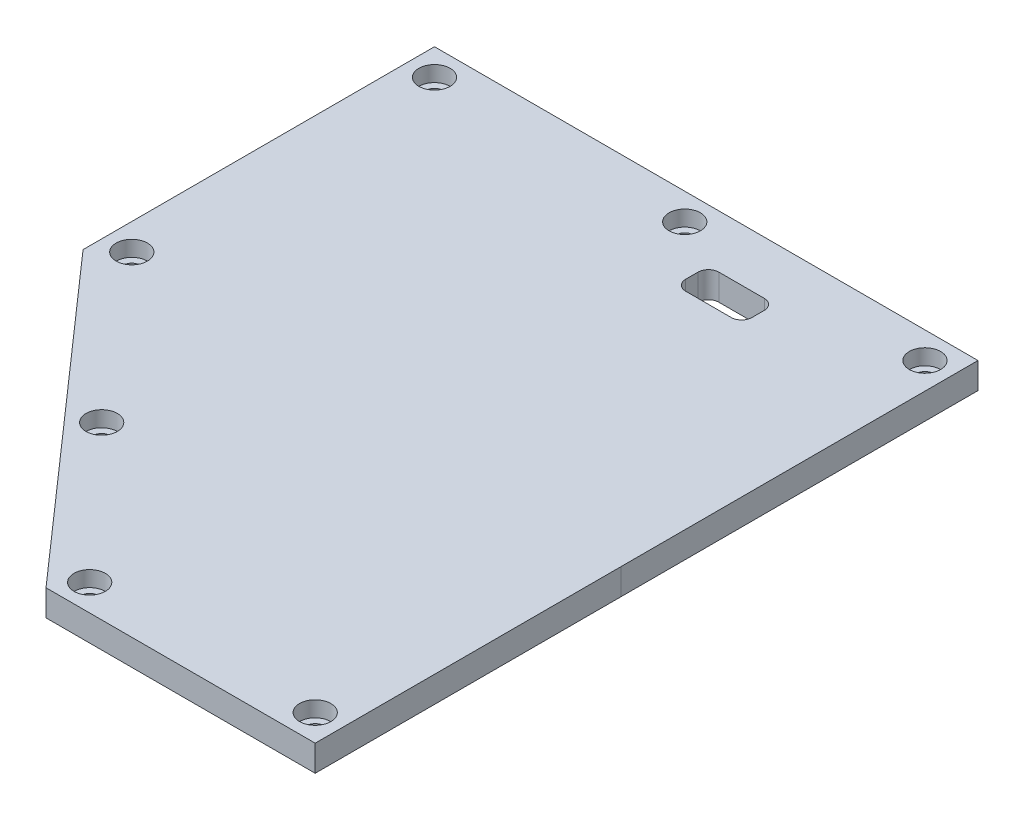
ISO-10303-21;
HEADER;
FILE_DESCRIPTION(('STEP AP214'),'2;1');
FILE_NAME('part.step','',(''),(''),'','','');
FILE_SCHEMA(('AUTOMOTIVE_DESIGN { 1 0 10303 214 1 1 1 1 }'));
ENDSEC;
DATA;
#1=APPLICATION_CONTEXT('core data for automotive mechanical design processes');
#2=APPLICATION_PROTOCOL_DEFINITION('international standard','automotive_design',2000,#1);
#3=PRODUCT_CONTEXT('',#1,'mechanical');
#4=PRODUCT('Part','Part','',(#3));
#5=PRODUCT_RELATED_PRODUCT_CATEGORY('part','',(#4));
#6=PRODUCT_DEFINITION_FORMATION('','',#4);
#7=PRODUCT_DEFINITION_CONTEXT('part definition',#1,'design');
#8=PRODUCT_DEFINITION('design','',#6,#7);
#9=PRODUCT_DEFINITION_SHAPE('','',#8);
#10=(LENGTH_UNIT() NAMED_UNIT(*) SI_UNIT(.MILLI.,.METRE.));
#11=(NAMED_UNIT(*) PLANE_ANGLE_UNIT() SI_UNIT($,.RADIAN.));
#12=(NAMED_UNIT(*) SI_UNIT($,.STERADIAN.) SOLID_ANGLE_UNIT());
#13=UNCERTAINTY_MEASURE_WITH_UNIT(LENGTH_MEASURE(1.E-05),#10,'distance_accuracy_value','');
#14=(GEOMETRIC_REPRESENTATION_CONTEXT(3) GLOBAL_UNCERTAINTY_ASSIGNED_CONTEXT((#13)) GLOBAL_UNIT_ASSIGNED_CONTEXT((#10,
#11,#12)) REPRESENTATION_CONTEXT('',''));
#15=CARTESIAN_POINT('',(0.,0.,0.));
#16=DIRECTION('',(0.,0.,1.));
#17=DIRECTION('',(1.,0.,0.));
#18=AXIS2_PLACEMENT_3D('',#15,#16,#17);
#19=CARTESIAN_POINT('',(5.08,5.,63.08));
#20=DIRECTION('',(0.,1.,0.));
#21=DIRECTION('',(0.,0.,1.));
#22=AXIS2_PLACEMENT_3D('',#19,#20,#21);
#23=CYLINDRICAL_SURFACE('',#22,1.64999999999999);
#24=CARTESIAN_POINT('',(5.08,0.,63.08));
#25=DIRECTION('',(0.,1.,0.));
#26=DIRECTION('',(0.,0.,1.));
#27=AXIS2_PLACEMENT_3D('',#24,#25,#26);
#28=CIRCLE('',#27,1.65);
#29=CARTESIAN_POINT('',(5.08,0.,64.73));
#30=VERTEX_POINT('',#29);
#31=EDGE_CURVE('E306',#30,#30,#28,.T.);
#32=ORIENTED_EDGE('',*,*,#31,.F.);
#33=EDGE_LOOP('',(#32));
#34=FACE_BOUND('',#33,.T.);
#35=CARTESIAN_POINT('',(5.08,2.,63.08));
#36=DIRECTION('',(0.,1.,0.));
#37=DIRECTION('',(0.,0.,1.));
#38=AXIS2_PLACEMENT_3D('',#35,#36,#37);
#39=CIRCLE('',#38,1.64999999999999);
#40=CARTESIAN_POINT('',(5.08,2.,64.73));
#41=VERTEX_POINT('',#40);
#42=EDGE_CURVE('E43',#41,#41,#39,.F.);
#43=ORIENTED_EDGE('',*,*,#42,.F.);
#44=EDGE_LOOP('',(#43));
#45=FACE_BOUND('',#44,.T.);
#46=ADVANCED_FACE('F39',(#34,#45),#23,.F.);
#47=CARTESIAN_POINT('',(30.4656304033941,5.,94.2360567244944));
#48=DIRECTION('',(0.,1.,0.));
#49=DIRECTION('',(0.,0.,1.));
#50=AXIS2_PLACEMENT_3D('',#47,#48,#49);
#51=CYLINDRICAL_SURFACE('',#50,1.65);
#52=CARTESIAN_POINT('',(30.4656304033941,0.,94.2360567244944));
#53=DIRECTION('',(0.,1.,0.));
#54=DIRECTION('',(0.,0.,1.));
#55=AXIS2_PLACEMENT_3D('',#52,#53,#54);
#56=CIRCLE('',#55,1.65);
#57=CARTESIAN_POINT('',(30.4656304033941,0.,95.8860567244944));
#58=VERTEX_POINT('',#57);
#59=EDGE_CURVE('E302',#58,#58,#56,.T.);
#60=ORIENTED_EDGE('',*,*,#59,.F.);
#61=EDGE_LOOP('',(#60));
#62=FACE_BOUND('',#61,.T.);
#63=CARTESIAN_POINT('',(30.4656304033941,2.,94.2360567244944));
#64=DIRECTION('',(0.,1.,0.));
#65=DIRECTION('',(0.,0.,1.));
#66=AXIS2_PLACEMENT_3D('',#63,#64,#65);
#67=CIRCLE('',#66,1.65);
#68=CARTESIAN_POINT('',(30.4656304033941,2.,95.8860567244944));
#69=VERTEX_POINT('',#68);
#70=EDGE_CURVE('E244',#69,#69,#67,.F.);
#71=ORIENTED_EDGE('',*,*,#70,.F.);
#72=EDGE_LOOP('',(#71));
#73=FACE_BOUND('',#72,.T.);
#74=ADVANCED_FACE('F376',(#62,#73),#51,.F.);
#75=CARTESIAN_POINT('',(55.850084456919,5.,121.919681711199));
#76=DIRECTION('',(0.,1.,0.));
#77=DIRECTION('',(0.,0.,1.));
#78=AXIS2_PLACEMENT_3D('',#75,#76,#77);
#79=CYLINDRICAL_SURFACE('',#78,1.65);
#80=CARTESIAN_POINT('',(55.850084456919,0.,121.919681711199));
#81=DIRECTION('',(0.,1.,0.));
#82=DIRECTION('',(0.,0.,1.));
#83=AXIS2_PLACEMENT_3D('',#80,#81,#82);
#84=CIRCLE('',#83,1.65);
#85=CARTESIAN_POINT('',(55.850084456919,0.,123.569681711199));
#86=VERTEX_POINT('',#85);
#87=EDGE_CURVE('E298',#86,#86,#84,.T.);
#88=ORIENTED_EDGE('',*,*,#87,.F.);
#89=EDGE_LOOP('',(#88));
#90=FACE_BOUND('',#89,.T.);
#91=CARTESIAN_POINT('',(55.850084456919,2.,121.919681711199));
#92=DIRECTION('',(0.,1.,0.));
#93=DIRECTION('',(0.,0.,1.));
#94=AXIS2_PLACEMENT_3D('',#91,#92,#93);
#95=CIRCLE('',#94,1.65);
#96=CARTESIAN_POINT('',(55.850084456919,2.,123.569681711199));
#97=VERTEX_POINT('',#96);
#98=EDGE_CURVE('E241',#97,#97,#95,.F.);
#99=ORIENTED_EDGE('',*,*,#98,.F.);
#100=EDGE_LOOP('',(#99));
#101=FACE_BOUND('',#100,.T.);
#102=ADVANCED_FACE('F382',(#90,#101),#79,.F.);
#103=CARTESIAN_POINT('',(99.060084456919,5.,121.919681711199));
#104=DIRECTION('',(0.,1.,0.));
#105=DIRECTION('',(0.,0.,1.));
#106=AXIS2_PLACEMENT_3D('',#103,#104,#105);
#107=CYLINDRICAL_SURFACE('',#106,1.64999999999999);
#108=CARTESIAN_POINT('',(99.060084456919,0.,121.919681711199));
#109=DIRECTION('',(0.,1.,0.));
#110=DIRECTION('',(0.,0.,1.));
#111=AXIS2_PLACEMENT_3D('',#108,#109,#110);
#112=CIRCLE('',#111,1.65);
#113=CARTESIAN_POINT('',(99.060084456919,0.,123.569681711199));
#114=VERTEX_POINT('',#113);
#115=EDGE_CURVE('E294',#114,#114,#112,.T.);
#116=ORIENTED_EDGE('',*,*,#115,.F.);
#117=EDGE_LOOP('',(#116));
#118=FACE_BOUND('',#117,.T.);
#119=CARTESIAN_POINT('',(99.060084456919,2.,121.919681711199));
#120=DIRECTION('',(0.,1.,0.));
#121=DIRECTION('',(0.,0.,1.));
#122=AXIS2_PLACEMENT_3D('',#119,#120,#121);
#123=CIRCLE('',#122,1.64999999999999);
#124=CARTESIAN_POINT('',(99.060084456919,2.,123.569681711199));
#125=VERTEX_POINT('',#124);
#126=EDGE_CURVE('E237',#125,#125,#123,.F.);
#127=ORIENTED_EDGE('',*,*,#126,.F.);
#128=EDGE_LOOP('',(#127));
#129=FACE_BOUND('',#128,.T.);
#130=ADVANCED_FACE('F630',(#118,#129),#107,.F.);
#131=CARTESIAN_POINT('',(99.0600062743914,5.,5.08));
#132=DIRECTION('',(0.,1.,0.));
#133=DIRECTION('',(0.,0.,1.));
#134=AXIS2_PLACEMENT_3D('',#131,#132,#133);
#135=CYLINDRICAL_SURFACE('',#134,1.64999999999999);
#136=CARTESIAN_POINT('',(99.0600062743914,0.,5.08));
#137=DIRECTION('',(0.,1.,0.));
#138=DIRECTION('',(0.,0.,1.));
#139=AXIS2_PLACEMENT_3D('',#136,#137,#138);
#140=CIRCLE('',#139,1.65);
#141=CARTESIAN_POINT('',(99.0600062743914,0.,6.73));
#142=VERTEX_POINT('',#141);
#143=EDGE_CURVE('E290',#142,#142,#140,.T.);
#144=ORIENTED_EDGE('',*,*,#143,.F.);
#145=EDGE_LOOP('',(#144));
#146=FACE_BOUND('',#145,.T.);
#147=CARTESIAN_POINT('',(99.0600062743914,2.,5.08));
#148=DIRECTION('',(0.,1.,0.));
#149=DIRECTION('',(0.,0.,1.));
#150=AXIS2_PLACEMENT_3D('',#147,#148,#149);
#151=CIRCLE('',#150,1.64999999999999);
#152=CARTESIAN_POINT('',(99.0600062743914,2.,6.72999999999999));
#153=VERTEX_POINT('',#152);
#154=EDGE_CURVE('E233',#153,#153,#151,.F.);
#155=ORIENTED_EDGE('',*,*,#154,.F.);
#156=EDGE_LOOP('',(#155));
#157=FACE_BOUND('',#156,.T.);
#158=ADVANCED_FACE('F638',(#146,#157),#135,.F.);
#159=CARTESIAN_POINT('',(53.03,5.,5.08));
#160=DIRECTION('',(0.,1.,0.));
#161=DIRECTION('',(0.,0.,1.));
#162=AXIS2_PLACEMENT_3D('',#159,#160,#161);
#163=CYLINDRICAL_SURFACE('',#162,1.65);
#164=CARTESIAN_POINT('',(53.03,0.,5.08));
#165=DIRECTION('',(0.,1.,0.));
#166=DIRECTION('',(0.,0.,1.));
#167=AXIS2_PLACEMENT_3D('',#164,#165,#166);
#168=CIRCLE('',#167,1.65);
#169=CARTESIAN_POINT('',(53.03,0.,6.73));
#170=VERTEX_POINT('',#169);
#171=EDGE_CURVE('E286',#170,#170,#168,.T.);
#172=ORIENTED_EDGE('',*,*,#171,.F.);
#173=EDGE_LOOP('',(#172));
#174=FACE_BOUND('',#173,.T.);
#175=CARTESIAN_POINT('',(53.03,2.,5.08));
#176=DIRECTION('',(0.,1.,0.));
#177=DIRECTION('',(0.,0.,1.));
#178=AXIS2_PLACEMENT_3D('',#175,#176,#177);
#179=CIRCLE('',#178,1.65);
#180=CARTESIAN_POINT('',(53.03,2.,6.73));
#181=VERTEX_POINT('',#180);
#182=EDGE_CURVE('E228',#181,#181,#179,.F.);
#183=ORIENTED_EDGE('',*,*,#182,.F.);
#184=EDGE_LOOP('',(#183));
#185=FACE_BOUND('',#184,.T.);
#186=ADVANCED_FACE('F647',(#174,#185),#163,.F.);
#187=CARTESIAN_POINT('',(5.08,5.,5.08));
#188=DIRECTION('',(0.,1.,0.));
#189=DIRECTION('',(0.,0.,1.));
#190=AXIS2_PLACEMENT_3D('',#187,#188,#189);
#191=CYLINDRICAL_SURFACE('',#190,1.64999999999999);
#192=CARTESIAN_POINT('',(5.08,0.,5.08));
#193=DIRECTION('',(0.,1.,0.));
#194=DIRECTION('',(0.,0.,1.));
#195=AXIS2_PLACEMENT_3D('',#192,#193,#194);
#196=CIRCLE('',#195,1.65);
#197=CARTESIAN_POINT('',(5.08,0.,6.73));
#198=VERTEX_POINT('',#197);
#199=EDGE_CURVE('E277',#198,#198,#196,.T.);
#200=ORIENTED_EDGE('',*,*,#199,.F.);
#201=EDGE_LOOP('',(#200));
#202=FACE_BOUND('',#201,.T.);
#203=CARTESIAN_POINT('',(5.08,2.,5.08));
#204=DIRECTION('',(0.,1.,0.));
#205=DIRECTION('',(0.,0.,1.));
#206=AXIS2_PLACEMENT_3D('',#203,#204,#205);
#207=CIRCLE('',#206,1.64999999999999);
#208=CARTESIAN_POINT('',(5.08,2.,6.73));
#209=VERTEX_POINT('',#208);
#210=EDGE_CURVE('E224',#209,#209,#207,.F.);
#211=ORIENTED_EDGE('',*,*,#210,.F.);
#212=EDGE_LOOP('',(#211));
#213=FACE_BOUND('',#212,.T.);
#214=ADVANCED_FACE('F656',(#202,#213),#191,.F.);
#215=CARTESIAN_POINT('',(0.,5.,0.));
#216=DIRECTION('',(1.,0.,0.));
#217=DIRECTION('',(0.,0.,-1.));
#218=AXIS2_PLACEMENT_3D('',#215,#216,#217);
#219=PLANE('',#218);
#220=DIRECTION('',(0.,0.,1.));
#221=VECTOR('',#220,1.);
#222=CARTESIAN_POINT('',(0.,0.,0.));
#223=LINE('',#222,#221);
#224=CARTESIAN_POINT('',(0.,0.,0.));
#225=VERTEX_POINT('',#224);
#226=CARTESIAN_POINT('',(0.,0.,67.34));
#227=VERTEX_POINT('',#226);
#228=EDGE_CURVE('E169',#225,#227,#223,.T.);
#229=ORIENTED_EDGE('',*,*,#228,.T.);
#230=DIRECTION('',(0.,-1.,0.));
#231=VECTOR('',#230,1.);
#232=CARTESIAN_POINT('',(0.,5.,67.34));
#233=LINE('',#232,#231);
#234=CARTESIAN_POINT('',(0.,5.,67.34));
#235=VERTEX_POINT('',#234);
#236=EDGE_CURVE('E147',#235,#227,#233,.T.);
#237=ORIENTED_EDGE('',*,*,#236,.F.);
#238=DIRECTION('',(0.,0.,1.));
#239=VECTOR('',#238,1.);
#240=CARTESIAN_POINT('',(0.,5.,0.));
#241=LINE('',#240,#239);
#242=CARTESIAN_POINT('',(0.,5.,0.));
#243=VERTEX_POINT('',#242);
#244=EDGE_CURVE('E155',#243,#235,#241,.T.);
#245=ORIENTED_EDGE('',*,*,#244,.F.);
#246=DIRECTION('',(0.,-1.,0.));
#247=VECTOR('',#246,1.);
#248=CARTESIAN_POINT('',(0.,5.,0.));
#249=LINE('',#248,#247);
#250=EDGE_CURVE('E320',#243,#225,#249,.T.);
#251=ORIENTED_EDGE('',*,*,#250,.T.);
#252=EDGE_LOOP('',(#229,#237,#245,#251));
#253=FACE_BOUND('',#252,.T.);
#254=ADVANCED_FACE('F167',(#253),#219,.F.);
#255=CARTESIAN_POINT('',(0.,5.,67.34));
#256=DIRECTION('',(0.75034186531504,0.,-0.661049986881134));
#257=DIRECTION('',(-0.661049986881134,0.,-0.75034186531504));
#258=AXIS2_PLACEMENT_3D('',#255,#256,#257);
#259=PLANE('',#258);
#260=DIRECTION('',(0.661049986881134,0.,0.75034186531504));
#261=VECTOR('',#260,1.);
#262=CARTESIAN_POINT('',(0.,0.,67.34));
#263=LINE('',#262,#261);
#264=CARTESIAN_POINT('',(52.560084456919,0.,126.999681711199));
#265=VERTEX_POINT('',#264);
#266=EDGE_CURVE('E323',#227,#265,#263,.T.);
#267=ORIENTED_EDGE('',*,*,#266,.T.);
#268=DIRECTION('',(0.,-1.,0.));
#269=VECTOR('',#268,1.);
#270=CARTESIAN_POINT('',(52.560084456919,5.,126.999681711199));
#271=LINE('',#270,#269);
#272=CARTESIAN_POINT('',(52.560084456919,5.,126.999681711199));
#273=VERTEX_POINT('',#272);
#274=EDGE_CURVE('E150',#273,#265,#271,.T.);
#275=ORIENTED_EDGE('',*,*,#274,.F.);
#276=DIRECTION('',(0.661049986881134,0.,0.75034186531504));
#277=VECTOR('',#276,1.);
#278=CARTESIAN_POINT('',(0.,5.,67.34));
#279=LINE('',#278,#277);
#280=EDGE_CURVE('E143',#235,#273,#279,.T.);
#281=ORIENTED_EDGE('',*,*,#280,.F.);
#282=ORIENTED_EDGE('',*,*,#236,.T.);
#283=EDGE_LOOP('',(#267,#275,#281,#282));
#284=FACE_BOUND('',#283,.T.);
#285=ADVANCED_FACE('F145',(#284),#259,.F.);
#286=CARTESIAN_POINT('',(104.140084456919,5.,126.999681711199));
#287=DIRECTION('',(0.,0.,-1.));
#288=DIRECTION('',(-1.,0.,0.));
#289=AXIS2_PLACEMENT_3D('',#286,#287,#288);
#290=PLANE('',#289);
#291=DIRECTION('',(1.,0.,0.));
#292=VECTOR('',#291,1.);
#293=CARTESIAN_POINT('',(104.140084456919,0.,126.999681711199));
#294=LINE('',#293,#292);
#295=CARTESIAN_POINT('',(104.140084456919,0.,126.999681711199));
#296=VERTEX_POINT('',#295);
#297=EDGE_CURVE('E326',#265,#296,#294,.T.);
#298=ORIENTED_EDGE('',*,*,#297,.T.);
#299=DIRECTION('',(0.,-1.,0.));
#300=VECTOR('',#299,1.);
#301=CARTESIAN_POINT('',(104.140084456919,5.,126.999681711199));
#302=LINE('',#301,#300);
#303=CARTESIAN_POINT('',(104.140084456919,5.,126.999681711199));
#304=VERTEX_POINT('',#303);
#305=EDGE_CURVE('E177',#304,#296,#302,.T.);
#306=ORIENTED_EDGE('',*,*,#305,.F.);
#307=DIRECTION('',(1.,0.,0.));
#308=VECTOR('',#307,1.);
#309=CARTESIAN_POINT('',(104.140084456919,5.,126.999681711199));
#310=LINE('',#309,#308);
#311=EDGE_CURVE('E154',#273,#304,#310,.T.);
#312=ORIENTED_EDGE('',*,*,#311,.F.);
#313=ORIENTED_EDGE('',*,*,#274,.T.);
#314=EDGE_LOOP('',(#298,#306,#312,#313));
#315=FACE_BOUND('',#314,.T.);
#316=ADVANCED_FACE('F366',(#315),#290,.F.);
#317=CARTESIAN_POINT('',(104.140084456919,5.,68.3796817111988));
#318=DIRECTION('',(-1.,0.,0.));
#319=DIRECTION('',(0.,0.,1.));
#320=AXIS2_PLACEMENT_3D('',#317,#318,#319);
#321=PLANE('',#320);
#322=DIRECTION('',(0.,0.,-1.));
#323=VECTOR('',#322,1.);
#324=CARTESIAN_POINT('',(104.140084456919,0.,68.3796817111988));
#325=LINE('',#324,#323);
#326=CARTESIAN_POINT('',(104.140084456919,0.,68.3796817111988));
#327=VERTEX_POINT('',#326);
#328=EDGE_CURVE('E329',#296,#327,#325,.T.);
#329=ORIENTED_EDGE('',*,*,#328,.T.);
#330=DIRECTION('',(0.,-1.,0.));
#331=VECTOR('',#330,1.);
#332=CARTESIAN_POINT('',(104.140084456919,5.,68.3796817111988));
#333=LINE('',#332,#331);
#334=CARTESIAN_POINT('',(104.140084456919,5.,68.3796817111988));
#335=VERTEX_POINT('',#334);
#336=EDGE_CURVE('E343',#335,#327,#333,.T.);
#337=ORIENTED_EDGE('',*,*,#336,.F.);
#338=DIRECTION('',(0.,0.,-1.));
#339=VECTOR('',#338,1.);
#340=CARTESIAN_POINT('',(104.140084456919,5.,68.3796817111988));
#341=LINE('',#340,#339);
#342=EDGE_CURVE('E312',#304,#335,#341,.T.);
#343=ORIENTED_EDGE('',*,*,#342,.F.);
#344=ORIENTED_EDGE('',*,*,#305,.T.);
#345=EDGE_LOOP('',(#329,#337,#343,#344));
#346=FACE_BOUND('',#345,.T.);
#347=ADVANCED_FACE('F352',(#346),#321,.F.);
#348=CARTESIAN_POINT('',(104.14,5.,0.));
#349=DIRECTION('',(-0.999999999999237,0.,1.2351171705755E-06));
#350=DIRECTION('',(1.2351171705755E-06,0.,0.999999999999237));
#351=AXIS2_PLACEMENT_3D('',#348,#349,#350);
#352=PLANE('',#351);
#353=DIRECTION('',(-1.2351171705755E-06,0.,-0.999999999999237));
#354=VECTOR('',#353,1.);
#355=CARTESIAN_POINT('',(104.14,0.,0.));
#356=LINE('',#355,#354);
#357=CARTESIAN_POINT('',(104.14,0.,0.));
#358=VERTEX_POINT('',#357);
#359=EDGE_CURVE('E332',#327,#358,#356,.T.);
#360=ORIENTED_EDGE('',*,*,#359,.T.);
#361=DIRECTION('',(0.,-1.,0.));
#362=VECTOR('',#361,1.);
#363=CARTESIAN_POINT('',(104.14,5.,0.));
#364=LINE('',#363,#362);
#365=CARTESIAN_POINT('',(104.14,5.,0.));
#366=VERTEX_POINT('',#365);
#367=EDGE_CURVE('E339',#366,#358,#364,.T.);
#368=ORIENTED_EDGE('',*,*,#367,.F.);
#369=DIRECTION('',(-1.2351171705755E-06,0.,-0.999999999999237));
#370=VECTOR('',#369,1.);
#371=CARTESIAN_POINT('',(104.14,5.,0.));
#372=LINE('',#371,#370);
#373=EDGE_CURVE('E315',#335,#366,#372,.T.);
#374=ORIENTED_EDGE('',*,*,#373,.F.);
#375=ORIENTED_EDGE('',*,*,#336,.T.);
#376=EDGE_LOOP('',(#360,#368,#374,#375));
#377=FACE_BOUND('',#376,.T.);
#378=ADVANCED_FACE('F362',(#377),#352,.F.);
#379=CARTESIAN_POINT('',(0.,5.,0.));
#380=DIRECTION('',(0.,0.,1.));
#381=DIRECTION('',(1.,0.,0.));
#382=AXIS2_PLACEMENT_3D('',#379,#380,#381);
#383=PLANE('',#382);
#384=DIRECTION('',(-1.,0.,0.));
#385=VECTOR('',#384,1.);
#386=CARTESIAN_POINT('',(0.,0.,0.));
#387=LINE('',#386,#385);
#388=EDGE_CURVE('E165',#358,#225,#387,.T.);
#389=ORIENTED_EDGE('',*,*,#388,.T.);
#390=ORIENTED_EDGE('',*,*,#250,.F.);
#391=DIRECTION('',(-1.,0.,0.));
#392=VECTOR('',#391,1.);
#393=CARTESIAN_POINT('',(0.,5.,0.));
#394=LINE('',#393,#392);
#395=EDGE_CURVE('E160',#366,#243,#394,.T.);
#396=ORIENTED_EDGE('',*,*,#395,.F.);
#397=ORIENTED_EDGE('',*,*,#367,.T.);
#398=EDGE_LOOP('',(#389,#390,#396,#397));
#399=FACE_BOUND('',#398,.T.);
#400=ADVANCED_FACE('F365',(#399),#383,.F.);
#401=CARTESIAN_POINT('',(0.,5.,0.));
#402=DIRECTION('',(0.,-1.,0.));
#403=DIRECTION('',(0.,0.,-1.));
#404=AXIS2_PLACEMENT_3D('',#401,#402,#403);
#405=PLANE('',#404);
#406=CARTESIAN_POINT('',(99.060084456919,5.,121.919681711199));
#407=DIRECTION('',(0.,1.,0.));
#408=DIRECTION('',(0.,0.,1.));
#409=AXIS2_PLACEMENT_3D('',#406,#407,#408);
#410=CIRCLE('',#409,3.00000000000001);
#411=CARTESIAN_POINT('',(99.060084456919,5.,124.919681711199));
#412=VERTEX_POINT('',#411);
#413=EDGE_CURVE('E802',#412,#412,#410,.T.);
#414=ORIENTED_EDGE('',*,*,#413,.F.);
#415=EDGE_LOOP('',(#414));
#416=FACE_BOUND('',#415,.T.);
#417=CARTESIAN_POINT('',(30.4656304033941,5.,94.2360567244944));
#418=DIRECTION('',(0.,1.,0.));
#419=DIRECTION('',(0.,0.,1.));
#420=AXIS2_PLACEMENT_3D('',#417,#418,#419);
#421=CIRCLE('',#420,3.);
#422=CARTESIAN_POINT('',(30.4656304033941,5.,97.2360567244944));
#423=VERTEX_POINT('',#422);
#424=EDGE_CURVE('E760',#423,#423,#421,.T.);
#425=ORIENTED_EDGE('',*,*,#424,.F.);
#426=EDGE_LOOP('',(#425));
#427=FACE_BOUND('',#426,.T.);
#428=CARTESIAN_POINT('',(5.08,5.,63.08));
#429=DIRECTION('',(0.,1.,0.));
#430=DIRECTION('',(0.,0.,1.));
#431=AXIS2_PLACEMENT_3D('',#428,#429,#430);
#432=CIRCLE('',#431,3.);
#433=CARTESIAN_POINT('',(5.08,5.,66.08));
#434=VERTEX_POINT('',#433);
#435=EDGE_CURVE('E753',#434,#434,#432,.T.);
#436=ORIENTED_EDGE('',*,*,#435,.F.);
#437=EDGE_LOOP('',(#436));
#438=FACE_BOUND('',#437,.T.);
#439=CARTESIAN_POINT('',(5.08,5.,5.08));
#440=DIRECTION('',(0.,1.,0.));
#441=DIRECTION('',(0.,0.,1.));
#442=AXIS2_PLACEMENT_3D('',#439,#440,#441);
#443=CIRCLE('',#442,3.);
#444=CARTESIAN_POINT('',(5.08,5.,8.08));
#445=VERTEX_POINT('',#444);
#446=EDGE_CURVE('E763',#445,#445,#443,.T.);
#447=ORIENTED_EDGE('',*,*,#446,.F.);
#448=EDGE_LOOP('',(#447));
#449=FACE_BOUND('',#448,.T.);
#450=CARTESIAN_POINT('',(53.03,5.,5.08));
#451=DIRECTION('',(0.,1.,0.));
#452=DIRECTION('',(0.,0.,1.));
#453=AXIS2_PLACEMENT_3D('',#450,#451,#452);
#454=CIRCLE('',#453,3.);
#455=CARTESIAN_POINT('',(53.03,5.,8.08));
#456=VERTEX_POINT('',#455);
#457=EDGE_CURVE('E826',#456,#456,#454,.T.);
#458=ORIENTED_EDGE('',*,*,#457,.F.);
#459=EDGE_LOOP('',(#458));
#460=FACE_BOUND('',#459,.T.);
#461=CARTESIAN_POINT('',(99.0600062743914,5.,5.08));
#462=DIRECTION('',(0.,1.,0.));
#463=DIRECTION('',(0.,0.,1.));
#464=AXIS2_PLACEMENT_3D('',#461,#462,#463);
#465=CIRCLE('',#464,2.99999999999999);
#466=CARTESIAN_POINT('',(99.0600062743914,5.,8.08));
#467=VERTEX_POINT('',#466);
#468=EDGE_CURVE('E810',#467,#467,#465,.T.);
#469=ORIENTED_EDGE('',*,*,#468,.F.);
#470=EDGE_LOOP('',(#469));
#471=FACE_BOUND('',#470,.T.);
#472=CARTESIAN_POINT('',(55.850084456919,5.,121.919681711199));
#473=DIRECTION('',(0.,1.,0.));
#474=DIRECTION('',(0.,0.,1.));
#475=AXIS2_PLACEMENT_3D('',#472,#473,#474);
#476=CIRCLE('',#475,3.);
#477=CARTESIAN_POINT('',(55.850084456919,5.,124.919681711199));
#478=VERTEX_POINT('',#477);
#479=EDGE_CURVE('E774',#478,#478,#476,.T.);
#480=ORIENTED_EDGE('',*,*,#479,.F.);
#481=EDGE_LOOP('',(#480));
#482=FACE_BOUND('',#481,.T.);
#483=DIRECTION('',(0.,0.,1.));
#484=VECTOR('',#483,1.);
#485=CARTESIAN_POINT('',(62.65,5.,10.16));
#486=LINE('',#485,#484);
#487=CARTESIAN_POINT('',(62.65,5.,12.16));
#488=VERTEX_POINT('',#487);
#489=CARTESIAN_POINT('',(62.65,5.,14.51));
#490=VERTEX_POINT('',#489);
#491=EDGE_CURVE('E263',#488,#490,#486,.T.);
#492=ORIENTED_EDGE('',*,*,#491,.F.);
#493=CARTESIAN_POINT('',(64.65,5.,12.16));
#494=DIRECTION('',(0.,-1.,0.));
#495=DIRECTION('',(0.,0.,-1.));
#496=AXIS2_PLACEMENT_3D('',#493,#494,#495);
#497=CIRCLE('',#496,2.);
#498=CARTESIAN_POINT('',(64.65,5.,10.16));
#499=VERTEX_POINT('',#498);
#500=EDGE_CURVE('E204',#488,#499,#497,.T.);
#501=ORIENTED_EDGE('',*,*,#500,.T.);
#502=DIRECTION('',(-1.,0.,0.));
#503=VECTOR('',#502,1.);
#504=CARTESIAN_POINT('',(62.65,5.,10.16));
#505=LINE('',#504,#503);
#506=CARTESIAN_POINT('',(73.35,5.,10.16));
#507=VERTEX_POINT('',#506);
#508=EDGE_CURVE('E256',#507,#499,#505,.T.);
#509=ORIENTED_EDGE('',*,*,#508,.F.);
#510=CARTESIAN_POINT('',(73.35,5.,12.16));
#511=DIRECTION('',(0.,-1.,0.));
#512=DIRECTION('',(0.,0.,-1.));
#513=AXIS2_PLACEMENT_3D('',#510,#511,#512);
#514=CIRCLE('',#513,2.);
#515=CARTESIAN_POINT('',(75.35,5.,12.16));
#516=VERTEX_POINT('',#515);
#517=EDGE_CURVE('E210',#507,#516,#514,.T.);
#518=ORIENTED_EDGE('',*,*,#517,.T.);
#519=DIRECTION('',(0.,0.,-1.));
#520=VECTOR('',#519,1.);
#521=CARTESIAN_POINT('',(75.35,5.,10.16));
#522=LINE('',#521,#520);
#523=CARTESIAN_POINT('',(75.35,5.,14.51));
#524=VERTEX_POINT('',#523);
#525=EDGE_CURVE('E251',#524,#516,#522,.T.);
#526=ORIENTED_EDGE('',*,*,#525,.F.);
#527=CARTESIAN_POINT('',(73.35,5.,14.51));
#528=DIRECTION('',(0.,-1.,0.));
#529=DIRECTION('',(0.,0.,-1.));
#530=AXIS2_PLACEMENT_3D('',#527,#528,#529);
#531=CIRCLE('',#530,2.);
#532=CARTESIAN_POINT('',(73.35,5.,16.51));
#533=VERTEX_POINT('',#532);
#534=EDGE_CURVE('E216',#524,#533,#531,.T.);
#535=ORIENTED_EDGE('',*,*,#534,.T.);
#536=DIRECTION('',(1.,0.,0.));
#537=VECTOR('',#536,1.);
#538=CARTESIAN_POINT('',(62.65,5.,16.51));
#539=LINE('',#538,#537);
#540=CARTESIAN_POINT('',(64.65,5.,16.51));
#541=VERTEX_POINT('',#540);
#542=EDGE_CURVE('E272',#541,#533,#539,.T.);
#543=ORIENTED_EDGE('',*,*,#542,.F.);
#544=CARTESIAN_POINT('',(64.65,5.,14.51));
#545=DIRECTION('',(0.,-1.,0.));
#546=DIRECTION('',(0.,0.,-1.));
#547=AXIS2_PLACEMENT_3D('',#544,#545,#546);
#548=CIRCLE('',#547,2.);
#549=EDGE_CURVE('E49',#541,#490,#548,.T.);
#550=ORIENTED_EDGE('',*,*,#549,.T.);
#551=EDGE_LOOP('',(#492,#501,#509,#518,#526,#535,#543,#550));
#552=FACE_BOUND('',#551,.T.);
#553=ORIENTED_EDGE('',*,*,#244,.T.);
#554=ORIENTED_EDGE('',*,*,#280,.T.);
#555=ORIENTED_EDGE('',*,*,#311,.T.);
#556=ORIENTED_EDGE('',*,*,#342,.T.);
#557=ORIENTED_EDGE('',*,*,#373,.T.);
#558=ORIENTED_EDGE('',*,*,#395,.T.);
#559=EDGE_LOOP('',(#553,#554,#555,#556,#557,#558));
#560=FACE_BOUND('',#559,.T.);
#561=ADVANCED_FACE('F158',(#416,#427,#438,#449,#460,#471,#482,#552,#560),#405,.F.);
#562=CARTESIAN_POINT('',(0.,0.,0.));
#563=DIRECTION('',(0.,-1.,0.));
#564=DIRECTION('',(0.,0.,-1.));
#565=AXIS2_PLACEMENT_3D('',#562,#563,#564);
#566=PLANE('',#565);
#567=DIRECTION('',(0.,0.,-1.));
#568=VECTOR('',#567,1.);
#569=CARTESIAN_POINT('',(75.35,0.,10.16));
#570=LINE('',#569,#568);
#571=CARTESIAN_POINT('',(75.35,0.,14.51));
#572=VERTEX_POINT('',#571);
#573=CARTESIAN_POINT('',(75.35,0.,12.16));
#574=VERTEX_POINT('',#573);
#575=EDGE_CURVE('E273',#572,#574,#570,.T.);
#576=ORIENTED_EDGE('',*,*,#575,.T.);
#577=CARTESIAN_POINT('',(73.35,0.,12.16));
#578=DIRECTION('',(0.,-1.,0.));
#579=DIRECTION('',(0.,0.,-1.));
#580=AXIS2_PLACEMENT_3D('',#577,#578,#579);
#581=CIRCLE('',#580,2.);
#582=CARTESIAN_POINT('',(73.35,0.,10.16));
#583=VERTEX_POINT('',#582);
#584=EDGE_CURVE('E213',#574,#583,#581,.F.);
#585=ORIENTED_EDGE('',*,*,#584,.T.);
#586=DIRECTION('',(-1.,0.,0.));
#587=VECTOR('',#586,1.);
#588=CARTESIAN_POINT('',(62.65,0.,10.16));
#589=LINE('',#588,#587);
#590=CARTESIAN_POINT('',(64.65,0.,10.16));
#591=VERTEX_POINT('',#590);
#592=EDGE_CURVE('E267',#583,#591,#589,.T.);
#593=ORIENTED_EDGE('',*,*,#592,.T.);
#594=CARTESIAN_POINT('',(64.65,0.,12.16));
#595=DIRECTION('',(0.,-1.,0.));
#596=DIRECTION('',(0.,0.,-1.));
#597=AXIS2_PLACEMENT_3D('',#594,#595,#596);
#598=CIRCLE('',#597,2.);
#599=CARTESIAN_POINT('',(62.65,0.,12.16));
#600=VERTEX_POINT('',#599);
#601=EDGE_CURVE('E207',#591,#600,#598,.F.);
#602=ORIENTED_EDGE('',*,*,#601,.T.);
#603=DIRECTION('',(0.,0.,1.));
#604=VECTOR('',#603,1.);
#605=CARTESIAN_POINT('',(62.65,0.,10.16));
#606=LINE('',#605,#604);
#607=CARTESIAN_POINT('',(62.65,0.,14.51));
#608=VERTEX_POINT('',#607);
#609=EDGE_CURVE('E271',#600,#608,#606,.T.);
#610=ORIENTED_EDGE('',*,*,#609,.T.);
#611=CARTESIAN_POINT('',(64.65,0.,14.51));
#612=DIRECTION('',(0.,-1.,0.));
#613=DIRECTION('',(0.,0.,-1.));
#614=AXIS2_PLACEMENT_3D('',#611,#612,#613);
#615=CIRCLE('',#614,2.);
#616=CARTESIAN_POINT('',(64.65,0.,16.51));
#617=VERTEX_POINT('',#616);
#618=EDGE_CURVE('E11',#608,#617,#615,.F.);
#619=ORIENTED_EDGE('',*,*,#618,.T.);
#620=DIRECTION('',(1.,0.,0.));
#621=VECTOR('',#620,1.);
#622=CARTESIAN_POINT('',(62.65,0.,16.51));
#623=LINE('',#622,#621);
#624=CARTESIAN_POINT('',(73.35,0.,16.51));
#625=VERTEX_POINT('',#624);
#626=EDGE_CURVE('E278',#617,#625,#623,.T.);
#627=ORIENTED_EDGE('',*,*,#626,.T.);
#628=CARTESIAN_POINT('',(73.35,0.,14.51));
#629=DIRECTION('',(0.,-1.,0.));
#630=DIRECTION('',(0.,0.,-1.));
#631=AXIS2_PLACEMENT_3D('',#628,#629,#630);
#632=CIRCLE('',#631,2.);
#633=EDGE_CURVE('E219',#625,#572,#632,.F.);
#634=ORIENTED_EDGE('',*,*,#633,.T.);
#635=EDGE_LOOP('',(#576,#585,#593,#602,#610,#619,#627,#634));
#636=FACE_BOUND('',#635,.T.);
#637=ORIENTED_EDGE('',*,*,#199,.T.);
#638=EDGE_LOOP('',(#637));
#639=FACE_BOUND('',#638,.T.);
#640=ORIENTED_EDGE('',*,*,#171,.T.);
#641=EDGE_LOOP('',(#640));
#642=FACE_BOUND('',#641,.T.);
#643=ORIENTED_EDGE('',*,*,#143,.T.);
#644=EDGE_LOOP('',(#643));
#645=FACE_BOUND('',#644,.T.);
#646=ORIENTED_EDGE('',*,*,#115,.T.);
#647=EDGE_LOOP('',(#646));
#648=FACE_BOUND('',#647,.T.);
#649=ORIENTED_EDGE('',*,*,#87,.T.);
#650=EDGE_LOOP('',(#649));
#651=FACE_BOUND('',#650,.T.);
#652=ORIENTED_EDGE('',*,*,#59,.T.);
#653=EDGE_LOOP('',(#652));
#654=FACE_BOUND('',#653,.T.);
#655=ORIENTED_EDGE('',*,*,#31,.T.);
#656=EDGE_LOOP('',(#655));
#657=FACE_BOUND('',#656,.T.);
#658=ORIENTED_EDGE('',*,*,#228,.F.);
#659=ORIENTED_EDGE('',*,*,#388,.F.);
#660=ORIENTED_EDGE('',*,*,#359,.F.);
#661=ORIENTED_EDGE('',*,*,#328,.F.);
#662=ORIENTED_EDGE('',*,*,#297,.F.);
#663=ORIENTED_EDGE('',*,*,#266,.F.);
#664=EDGE_LOOP('',(#658,#659,#660,#661,#662,#663));
#665=FACE_BOUND('',#664,.T.);
#666=ADVANCED_FACE('F358',(#636,#639,#642,#645,#648,#651,#654,#657,#665),#566,.T.);
#667=CARTESIAN_POINT('',(62.65,-14.1990316571237,10.16));
#668=DIRECTION('',(0.,0.,-1.));
#669=DIRECTION('',(-1.,0.,0.));
#670=AXIS2_PLACEMENT_3D('',#667,#668,#669);
#671=PLANE('',#670);
#672=ORIENTED_EDGE('',*,*,#508,.T.);
#673=DIRECTION('',(0.,1.,0.));
#674=VECTOR('',#673,1.);
#675=CARTESIAN_POINT('',(64.65,0.,10.16));
#676=LINE('',#675,#674);
#677=EDGE_CURVE('E188',#499,#591,#676,.F.);
#678=ORIENTED_EDGE('',*,*,#677,.T.);
#679=ORIENTED_EDGE('',*,*,#592,.F.);
#680=DIRECTION('',(0.,1.,0.));
#681=VECTOR('',#680,1.);
#682=CARTESIAN_POINT('',(73.35,5.,10.16));
#683=LINE('',#682,#681);
#684=EDGE_CURVE('E184',#583,#507,#683,.T.);
#685=ORIENTED_EDGE('',*,*,#684,.T.);
#686=EDGE_LOOP('',(#672,#678,#679,#685));
#687=FACE_BOUND('',#686,.T.);
#688=ADVANCED_FACE('F394',(#687),#671,.F.);
#689=CARTESIAN_POINT('',(62.65,-14.1990316571237,10.16));
#690=DIRECTION('',(-1.,0.,0.));
#691=DIRECTION('',(0.,0.,1.));
#692=AXIS2_PLACEMENT_3D('',#689,#690,#691);
#693=PLANE('',#692);
#694=ORIENTED_EDGE('',*,*,#609,.F.);
#695=DIRECTION('',(0.,1.,0.));
#696=VECTOR('',#695,1.);
#697=CARTESIAN_POINT('',(62.65,5.,12.16));
#698=LINE('',#697,#696);
#699=EDGE_CURVE('E175',#600,#488,#698,.T.);
#700=ORIENTED_EDGE('',*,*,#699,.T.);
#701=ORIENTED_EDGE('',*,*,#491,.T.);
#702=DIRECTION('',(0.,1.,0.));
#703=VECTOR('',#702,1.);
#704=CARTESIAN_POINT('',(62.65,0.,14.51));
#705=LINE('',#704,#703);
#706=EDGE_CURVE('E171',#490,#608,#705,.F.);
#707=ORIENTED_EDGE('',*,*,#706,.T.);
#708=EDGE_LOOP('',(#694,#700,#701,#707));
#709=FACE_BOUND('',#708,.T.);
#710=ADVANCED_FACE('F422',(#709),#693,.F.);
#711=CARTESIAN_POINT('',(62.65,-14.1990316571237,16.51));
#712=DIRECTION('',(0.,0.,1.));
#713=DIRECTION('',(1.,0.,0.));
#714=AXIS2_PLACEMENT_3D('',#711,#712,#713);
#715=PLANE('',#714);
#716=ORIENTED_EDGE('',*,*,#542,.T.);
#717=DIRECTION('',(0.,1.,0.));
#718=VECTOR('',#717,1.);
#719=CARTESIAN_POINT('',(73.35,0.,16.51));
#720=LINE('',#719,#718);
#721=EDGE_CURVE('E57',#533,#625,#720,.F.);
#722=ORIENTED_EDGE('',*,*,#721,.T.);
#723=ORIENTED_EDGE('',*,*,#626,.F.);
#724=DIRECTION('',(0.,1.,0.));
#725=VECTOR('',#724,1.);
#726=CARTESIAN_POINT('',(64.65,5.,16.51));
#727=LINE('',#726,#725);
#728=EDGE_CURVE('E198',#617,#541,#727,.T.);
#729=ORIENTED_EDGE('',*,*,#728,.T.);
#730=EDGE_LOOP('',(#716,#722,#723,#729));
#731=FACE_BOUND('',#730,.T.);
#732=ADVANCED_FACE('F430',(#731),#715,.F.);
#733=CARTESIAN_POINT('',(75.35,-14.1990316571237,10.16));
#734=DIRECTION('',(1.,0.,0.));
#735=DIRECTION('',(0.,0.,-1.));
#736=AXIS2_PLACEMENT_3D('',#733,#734,#735);
#737=PLANE('',#736);
#738=ORIENTED_EDGE('',*,*,#525,.T.);
#739=DIRECTION('',(0.,1.,0.));
#740=VECTOR('',#739,1.);
#741=CARTESIAN_POINT('',(75.35,0.,12.16));
#742=LINE('',#741,#740);
#743=EDGE_CURVE('E195',#516,#574,#742,.F.);
#744=ORIENTED_EDGE('',*,*,#743,.T.);
#745=ORIENTED_EDGE('',*,*,#575,.F.);
#746=DIRECTION('',(0.,1.,0.));
#747=VECTOR('',#746,1.);
#748=CARTESIAN_POINT('',(75.35,5.,14.51));
#749=LINE('',#748,#747);
#750=EDGE_CURVE('E191',#572,#524,#749,.T.);
#751=ORIENTED_EDGE('',*,*,#750,.T.);
#752=EDGE_LOOP('',(#738,#744,#745,#751));
#753=FACE_BOUND('',#752,.T.);
#754=ADVANCED_FACE('F438',(#753),#737,.F.);
#755=CARTESIAN_POINT('',(64.65,-14.1990316571237,12.16));
#756=DIRECTION('',(0.,-1.,0.));
#757=DIRECTION('',(0.,0.,-1.));
#758=AXIS2_PLACEMENT_3D('',#755,#756,#757);
#759=CYLINDRICAL_SURFACE('',#758,2.);
#760=ORIENTED_EDGE('',*,*,#601,.F.);
#761=ORIENTED_EDGE('',*,*,#677,.F.);
#762=ORIENTED_EDGE('',*,*,#500,.F.);
#763=ORIENTED_EDGE('',*,*,#699,.F.);
#764=EDGE_LOOP('',(#760,#761,#762,#763));
#765=FACE_BOUND('',#764,.T.);
#766=ADVANCED_FACE('F445',(#765),#759,.F.);
#767=CARTESIAN_POINT('',(73.35,-14.1990316571237,12.16));
#768=DIRECTION('',(0.,-1.,0.));
#769=DIRECTION('',(0.,0.,-1.));
#770=AXIS2_PLACEMENT_3D('',#767,#768,#769);
#771=CYLINDRICAL_SURFACE('',#770,2.);
#772=ORIENTED_EDGE('',*,*,#584,.F.);
#773=ORIENTED_EDGE('',*,*,#743,.F.);
#774=ORIENTED_EDGE('',*,*,#517,.F.);
#775=ORIENTED_EDGE('',*,*,#684,.F.);
#776=EDGE_LOOP('',(#772,#773,#774,#775));
#777=FACE_BOUND('',#776,.T.);
#778=ADVANCED_FACE('F452',(#777),#771,.F.);
#779=CARTESIAN_POINT('',(73.35,-14.1990316571237,14.51));
#780=DIRECTION('',(0.,-1.,0.));
#781=DIRECTION('',(0.,0.,-1.));
#782=AXIS2_PLACEMENT_3D('',#779,#780,#781);
#783=CYLINDRICAL_SURFACE('',#782,2.);
#784=ORIENTED_EDGE('',*,*,#633,.F.);
#785=ORIENTED_EDGE('',*,*,#721,.F.);
#786=ORIENTED_EDGE('',*,*,#534,.F.);
#787=ORIENTED_EDGE('',*,*,#750,.F.);
#788=EDGE_LOOP('',(#784,#785,#786,#787));
#789=FACE_BOUND('',#788,.T.);
#790=ADVANCED_FACE('F460',(#789),#783,.F.);
#791=CARTESIAN_POINT('',(64.65,-14.1990316571237,14.51));
#792=DIRECTION('',(0.,-1.,0.));
#793=DIRECTION('',(0.,0.,-1.));
#794=AXIS2_PLACEMENT_3D('',#791,#792,#793);
#795=CYLINDRICAL_SURFACE('',#794,2.);
#796=ORIENTED_EDGE('',*,*,#618,.F.);
#797=ORIENTED_EDGE('',*,*,#706,.F.);
#798=ORIENTED_EDGE('',*,*,#549,.F.);
#799=ORIENTED_EDGE('',*,*,#728,.F.);
#800=EDGE_LOOP('',(#796,#797,#798,#799));
#801=FACE_BOUND('',#800,.T.);
#802=ADVANCED_FACE('F41',(#801),#795,.F.);
#803=CARTESIAN_POINT('',(5.08,2.,5.08));
#804=DIRECTION('',(0.,1.,0.));
#805=DIRECTION('',(0.,0.,1.));
#806=AXIS2_PLACEMENT_3D('',#803,#804,#805);
#807=PLANE('',#806);
#808=CARTESIAN_POINT('',(5.08,2.,5.08));
#809=DIRECTION('',(0.,1.,0.));
#810=DIRECTION('',(0.,0.,1.));
#811=AXIS2_PLACEMENT_3D('',#808,#809,#810);
#812=CIRCLE('',#811,3.);
#813=CARTESIAN_POINT('',(5.08,2.,8.08));
#814=VERTEX_POINT('',#813);
#815=EDGE_CURVE('E756',#814,#814,#812,.T.);
#816=ORIENTED_EDGE('',*,*,#815,.T.);
#817=EDGE_LOOP('',(#816));
#818=FACE_BOUND('',#817,.T.);
#819=ORIENTED_EDGE('',*,*,#210,.T.);
#820=EDGE_LOOP('',(#819));
#821=FACE_BOUND('',#820,.T.);
#822=ADVANCED_FACE('F474',(#818,#821),#807,.T.);
#823=CARTESIAN_POINT('',(5.08,2.,5.08));
#824=DIRECTION('',(0.,1.,0.));
#825=DIRECTION('',(0.,0.,1.));
#826=AXIS2_PLACEMENT_3D('',#823,#824,#825);
#827=CYLINDRICAL_SURFACE('',#826,3.);
#828=ORIENTED_EDGE('',*,*,#815,.F.);
#829=EDGE_LOOP('',(#828));
#830=FACE_BOUND('',#829,.T.);
#831=ORIENTED_EDGE('',*,*,#446,.T.);
#832=EDGE_LOOP('',(#831));
#833=FACE_BOUND('',#832,.T.);
#834=ADVANCED_FACE('F480',(#830,#833),#827,.F.);
#835=CARTESIAN_POINT('',(53.03,2.,5.08));
#836=DIRECTION('',(0.,1.,0.));
#837=DIRECTION('',(0.,0.,1.));
#838=AXIS2_PLACEMENT_3D('',#835,#836,#837);
#839=PLANE('',#838);
#840=CARTESIAN_POINT('',(53.03,2.,5.08));
#841=DIRECTION('',(0.,1.,0.));
#842=DIRECTION('',(0.,0.,1.));
#843=AXIS2_PLACEMENT_3D('',#840,#841,#842);
#844=CIRCLE('',#843,3.);
#845=CARTESIAN_POINT('',(53.03,2.,8.08));
#846=VERTEX_POINT('',#845);
#847=EDGE_CURVE('E770',#846,#846,#844,.T.);
#848=ORIENTED_EDGE('',*,*,#847,.T.);
#849=EDGE_LOOP('',(#848));
#850=FACE_BOUND('',#849,.T.);
#851=ORIENTED_EDGE('',*,*,#182,.T.);
#852=EDGE_LOOP('',(#851));
#853=FACE_BOUND('',#852,.T.);
#854=ADVANCED_FACE('F488',(#850,#853),#839,.T.);
#855=CARTESIAN_POINT('',(53.03,2.,5.08));
#856=DIRECTION('',(0.,1.,0.));
#857=DIRECTION('',(0.,0.,1.));
#858=AXIS2_PLACEMENT_3D('',#855,#856,#857);
#859=CYLINDRICAL_SURFACE('',#858,3.);
#860=ORIENTED_EDGE('',*,*,#847,.F.);
#861=EDGE_LOOP('',(#860));
#862=FACE_BOUND('',#861,.T.);
#863=ORIENTED_EDGE('',*,*,#457,.T.);
#864=EDGE_LOOP('',(#863));
#865=FACE_BOUND('',#864,.T.);
#866=ADVANCED_FACE('F496',(#862,#865),#859,.F.);
#867=CARTESIAN_POINT('',(99.0600062743914,2.,5.08));
#868=DIRECTION('',(0.,1.,0.));
#869=DIRECTION('',(0.,0.,1.));
#870=AXIS2_PLACEMENT_3D('',#867,#868,#869);
#871=PLANE('',#870);
#872=CARTESIAN_POINT('',(99.0600062743914,2.,5.08));
#873=DIRECTION('',(0.,1.,0.));
#874=DIRECTION('',(0.,0.,1.));
#875=AXIS2_PLACEMENT_3D('',#872,#873,#874);
#876=CIRCLE('',#875,2.99999999999999);
#877=CARTESIAN_POINT('',(99.0600062743914,2.,8.08));
#878=VERTEX_POINT('',#877);
#879=EDGE_CURVE('E832',#878,#878,#876,.T.);
#880=ORIENTED_EDGE('',*,*,#879,.T.);
#881=EDGE_LOOP('',(#880));
#882=FACE_BOUND('',#881,.T.);
#883=ORIENTED_EDGE('',*,*,#154,.T.);
#884=EDGE_LOOP('',(#883));
#885=FACE_BOUND('',#884,.T.);
#886=ADVANCED_FACE('F504',(#882,#885),#871,.T.);
#887=CARTESIAN_POINT('',(99.0600062743914,2.,5.08));
#888=DIRECTION('',(0.,1.,0.));
#889=DIRECTION('',(0.,0.,1.));
#890=AXIS2_PLACEMENT_3D('',#887,#888,#889);
#891=CYLINDRICAL_SURFACE('',#890,2.99999999999999);
#892=ORIENTED_EDGE('',*,*,#879,.F.);
#893=EDGE_LOOP('',(#892));
#894=FACE_BOUND('',#893,.T.);
#895=ORIENTED_EDGE('',*,*,#468,.T.);
#896=EDGE_LOOP('',(#895));
#897=FACE_BOUND('',#896,.T.);
#898=ADVANCED_FACE('F512',(#894,#897),#891,.F.);
#899=CARTESIAN_POINT('',(99.060084456919,2.,121.919681711199));
#900=DIRECTION('',(0.,1.,0.));
#901=DIRECTION('',(0.,0.,1.));
#902=AXIS2_PLACEMENT_3D('',#899,#900,#901);
#903=PLANE('',#902);
#904=CARTESIAN_POINT('',(99.060084456919,2.,121.919681711199));
#905=DIRECTION('',(0.,1.,0.));
#906=DIRECTION('',(0.,0.,1.));
#907=AXIS2_PLACEMENT_3D('',#904,#905,#906);
#908=CIRCLE('',#907,3.00000000000001);
#909=CARTESIAN_POINT('',(99.060084456919,2.,124.919681711199));
#910=VERTEX_POINT('',#909);
#911=EDGE_CURVE('E778',#910,#910,#908,.T.);
#912=ORIENTED_EDGE('',*,*,#911,.T.);
#913=EDGE_LOOP('',(#912));
#914=FACE_BOUND('',#913,.T.);
#915=ORIENTED_EDGE('',*,*,#126,.T.);
#916=EDGE_LOOP('',(#915));
#917=FACE_BOUND('',#916,.T.);
#918=ADVANCED_FACE('F520',(#914,#917),#903,.T.);
#919=CARTESIAN_POINT('',(99.060084456919,2.,121.919681711199));
#920=DIRECTION('',(0.,1.,0.));
#921=DIRECTION('',(0.,0.,1.));
#922=AXIS2_PLACEMENT_3D('',#919,#920,#921);
#923=CYLINDRICAL_SURFACE('',#922,3.00000000000001);
#924=ORIENTED_EDGE('',*,*,#911,.F.);
#925=EDGE_LOOP('',(#924));
#926=FACE_BOUND('',#925,.T.);
#927=ORIENTED_EDGE('',*,*,#413,.T.);
#928=EDGE_LOOP('',(#927));
#929=FACE_BOUND('',#928,.T.);
#930=ADVANCED_FACE('F528',(#926,#929),#923,.F.);
#931=CARTESIAN_POINT('',(55.850084456919,2.,121.919681711199));
#932=DIRECTION('',(0.,1.,0.));
#933=DIRECTION('',(0.,0.,1.));
#934=AXIS2_PLACEMENT_3D('',#931,#932,#933);
#935=PLANE('',#934);
#936=CARTESIAN_POINT('',(55.850084456919,2.,121.919681711199));
#937=DIRECTION('',(0.,1.,0.));
#938=DIRECTION('',(0.,0.,1.));
#939=AXIS2_PLACEMENT_3D('',#936,#937,#938);
#940=CIRCLE('',#939,3.);
#941=CARTESIAN_POINT('',(55.850084456919,2.,124.919681711199));
#942=VERTEX_POINT('',#941);
#943=EDGE_CURVE('E229',#942,#942,#940,.T.);
#944=ORIENTED_EDGE('',*,*,#943,.T.);
#945=EDGE_LOOP('',(#944));
#946=FACE_BOUND('',#945,.T.);
#947=ORIENTED_EDGE('',*,*,#98,.T.);
#948=EDGE_LOOP('',(#947));
#949=FACE_BOUND('',#948,.T.);
#950=ADVANCED_FACE('F536',(#946,#949),#935,.T.);
#951=CARTESIAN_POINT('',(55.850084456919,2.,121.919681711199));
#952=DIRECTION('',(0.,1.,0.));
#953=DIRECTION('',(0.,0.,1.));
#954=AXIS2_PLACEMENT_3D('',#951,#952,#953);
#955=CYLINDRICAL_SURFACE('',#954,3.);
#956=ORIENTED_EDGE('',*,*,#943,.F.);
#957=EDGE_LOOP('',(#956));
#958=FACE_BOUND('',#957,.T.);
#959=ORIENTED_EDGE('',*,*,#479,.T.);
#960=EDGE_LOOP('',(#959));
#961=FACE_BOUND('',#960,.T.);
#962=ADVANCED_FACE('F544',(#958,#961),#955,.F.);
#963=CARTESIAN_POINT('',(30.4656304033941,2.,94.2360567244944));
#964=DIRECTION('',(0.,1.,0.));
#965=DIRECTION('',(0.,0.,1.));
#966=AXIS2_PLACEMENT_3D('',#963,#964,#965);
#967=PLANE('',#966);
#968=CARTESIAN_POINT('',(30.4656304033941,2.,94.2360567244944));
#969=DIRECTION('',(0.,1.,0.));
#970=DIRECTION('',(0.,0.,1.));
#971=AXIS2_PLACEMENT_3D('',#968,#969,#970);
#972=CIRCLE('',#971,3.);
#973=CARTESIAN_POINT('',(30.4656304033941,2.,97.2360567244944));
#974=VERTEX_POINT('',#973);
#975=EDGE_CURVE('E807',#974,#974,#972,.T.);
#976=ORIENTED_EDGE('',*,*,#975,.T.);
#977=EDGE_LOOP('',(#976));
#978=FACE_BOUND('',#977,.T.);
#979=ORIENTED_EDGE('',*,*,#70,.T.);
#980=EDGE_LOOP('',(#979));
#981=FACE_BOUND('',#980,.T.);
#982=ADVANCED_FACE('F552',(#978,#981),#967,.T.);
#983=CARTESIAN_POINT('',(30.4656304033941,2.,94.2360567244944));
#984=DIRECTION('',(0.,1.,0.));
#985=DIRECTION('',(0.,0.,1.));
#986=AXIS2_PLACEMENT_3D('',#983,#984,#985);
#987=CYLINDRICAL_SURFACE('',#986,3.);
#988=ORIENTED_EDGE('',*,*,#975,.F.);
#989=EDGE_LOOP('',(#988));
#990=FACE_BOUND('',#989,.T.);
#991=ORIENTED_EDGE('',*,*,#424,.T.);
#992=EDGE_LOOP('',(#991));
#993=FACE_BOUND('',#992,.T.);
#994=ADVANCED_FACE('F560',(#990,#993),#987,.F.);
#995=CARTESIAN_POINT('',(5.08,2.,63.08));
#996=DIRECTION('',(0.,1.,0.));
#997=DIRECTION('',(0.,0.,1.));
#998=AXIS2_PLACEMENT_3D('',#995,#996,#997);
#999=PLANE('',#998);
#1000=CARTESIAN_POINT('',(5.08,2.,63.08));
#1001=DIRECTION('',(0.,1.,0.));
#1002=DIRECTION('',(0.,0.,1.));
#1003=AXIS2_PLACEMENT_3D('',#1000,#1001,#1002);
#1004=CIRCLE('',#1003,3.);
#1005=CARTESIAN_POINT('',(5.08,2.,66.08));
#1006=VERTEX_POINT('',#1005);
#1007=EDGE_CURVE('E750',#1006,#1006,#1004,.T.);
#1008=ORIENTED_EDGE('',*,*,#1007,.T.);
#1009=EDGE_LOOP('',(#1008));
#1010=FACE_BOUND('',#1009,.T.);
#1011=ORIENTED_EDGE('',*,*,#42,.T.);
#1012=EDGE_LOOP('',(#1011));
#1013=FACE_BOUND('',#1012,.T.);
#1014=ADVANCED_FACE('F568',(#1010,#1013),#999,.T.);
#1015=CARTESIAN_POINT('',(5.08,2.,63.08));
#1016=DIRECTION('',(0.,1.,0.));
#1017=DIRECTION('',(0.,0.,1.));
#1018=AXIS2_PLACEMENT_3D('',#1015,#1016,#1017);
#1019=CYLINDRICAL_SURFACE('',#1018,3.);
#1020=ORIENTED_EDGE('',*,*,#1007,.F.);
#1021=EDGE_LOOP('',(#1020));
#1022=FACE_BOUND('',#1021,.T.);
#1023=ORIENTED_EDGE('',*,*,#435,.T.);
#1024=EDGE_LOOP('',(#1023));
#1025=FACE_BOUND('',#1024,.T.);
#1026=ADVANCED_FACE('F576',(#1022,#1025),#1019,.F.);
#1027=CLOSED_SHELL('',(#46,#74,#102,#130,#158,#186,#214,#254,#285,#316,#347,#378,#400,#561,#666,
#688,#710,#732,#754,#766,#778,#790,#802,#822,#834,#854,#866,#886,#898,#918,#930,#950,#962,#982,
#994,#1014,#1026));
#1028=MANIFOLD_SOLID_BREP('B2',#1027);
#1029=ADVANCED_BREP_SHAPE_REPRESENTATION('',(#18,#1028),#14);
#1030=SHAPE_DEFINITION_REPRESENTATION(#9,#1029);
ENDSEC;
END-ISO-10303-21;
